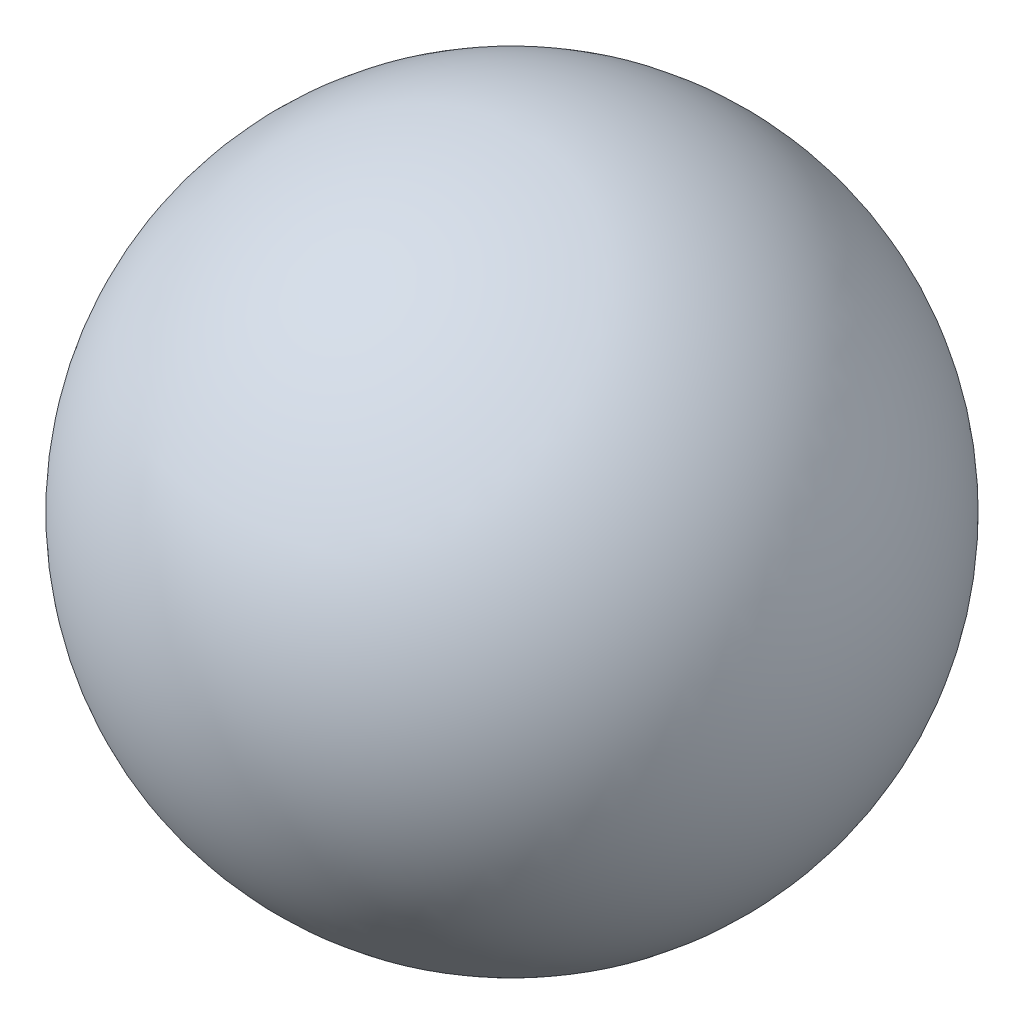
ISO-10303-21;
HEADER;
FILE_DESCRIPTION(('STEP AP214'),'2;1');
FILE_NAME('part.step','',(''),(''),'','','');
FILE_SCHEMA(('AUTOMOTIVE_DESIGN { 1 0 10303 214 1 1 1 1 }'));
ENDSEC;
DATA;
#1=APPLICATION_CONTEXT('core data for automotive mechanical design processes');
#2=APPLICATION_PROTOCOL_DEFINITION('international standard','automotive_design',2000,#1);
#3=PRODUCT_CONTEXT('',#1,'mechanical');
#4=PRODUCT('Part','Part','',(#3));
#5=PRODUCT_RELATED_PRODUCT_CATEGORY('part','',(#4));
#6=PRODUCT_DEFINITION_FORMATION('','',#4);
#7=PRODUCT_DEFINITION_CONTEXT('part definition',#1,'design');
#8=PRODUCT_DEFINITION('design','',#6,#7);
#9=PRODUCT_DEFINITION_SHAPE('','',#8);
#10=(LENGTH_UNIT() NAMED_UNIT(*) SI_UNIT(.MILLI.,.METRE.));
#11=(NAMED_UNIT(*) PLANE_ANGLE_UNIT() SI_UNIT($,.RADIAN.));
#12=(NAMED_UNIT(*) SI_UNIT($,.STERADIAN.) SOLID_ANGLE_UNIT());
#13=UNCERTAINTY_MEASURE_WITH_UNIT(LENGTH_MEASURE(1.E-05),#10,'distance_accuracy_value','');
#14=(GEOMETRIC_REPRESENTATION_CONTEXT(3) GLOBAL_UNCERTAINTY_ASSIGNED_CONTEXT((#13)) GLOBAL_UNIT_ASSIGNED_CONTEXT((#10,
#11,#12)) REPRESENTATION_CONTEXT('',''));
#15=CARTESIAN_POINT('',(0.,0.,0.));
#16=DIRECTION('',(0.,0.,1.));
#17=DIRECTION('',(1.,0.,0.));
#18=AXIS2_PLACEMENT_3D('',#15,#16,#17);
#19=CARTESIAN_POINT('',(0.,0.,0.));
#20=DIRECTION('',(0.,-1.,0.));
#21=DIRECTION('',(-1.,0.,0.));
#22=AXIS2_PLACEMENT_3D('',#19,#20,#21);
#23=SPHERICAL_SURFACE('',#22,110.159093861055);
#24=CARTESIAN_POINT('',(0.,-110.159093861055,0.));
#25=VERTEX_POINT('',#24);
#26=VERTEX_LOOP('',#25);
#27=FACE_BOUND('',#26,.T.);
#28=ADVANCED_FACE('F33',(#27),#23,.T.);
#29=CLOSED_SHELL('',(#28));
#30=MANIFOLD_SOLID_BREP('B2',#29);
#31=ADVANCED_BREP_SHAPE_REPRESENTATION('',(#18,#30),#14);
#32=SHAPE_DEFINITION_REPRESENTATION(#9,#31);
ENDSEC;
END-ISO-10303-21;
